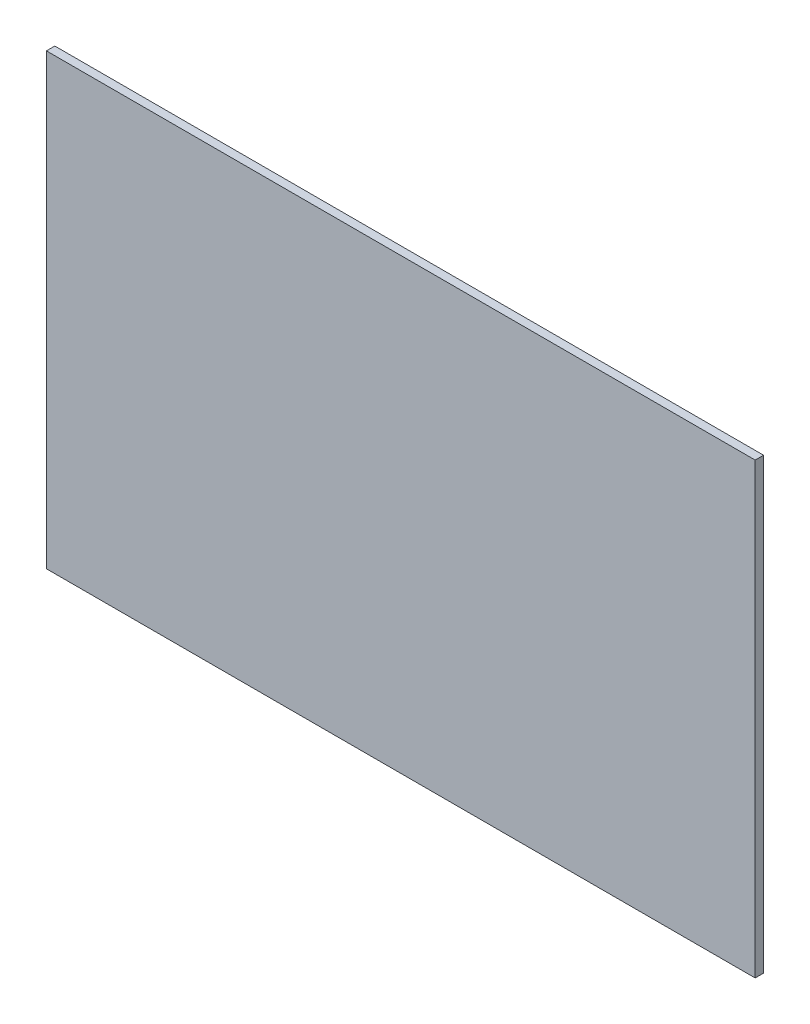
ISO-10303-21;
HEADER;
FILE_DESCRIPTION(('STEP AP214'),'2;1');
FILE_NAME('part.step','',(''),(''),'','','');
FILE_SCHEMA(('AUTOMOTIVE_DESIGN { 1 0 10303 214 1 1 1 1 }'));
ENDSEC;
DATA;
#1=APPLICATION_CONTEXT('core data for automotive mechanical design processes');
#2=APPLICATION_PROTOCOL_DEFINITION('international standard','automotive_design',2000,#1);
#3=PRODUCT_CONTEXT('',#1,'mechanical');
#4=PRODUCT('Part','Part','',(#3));
#5=PRODUCT_RELATED_PRODUCT_CATEGORY('part','',(#4));
#6=PRODUCT_DEFINITION_FORMATION('','',#4);
#7=PRODUCT_DEFINITION_CONTEXT('part definition',#1,'design');
#8=PRODUCT_DEFINITION('design','',#6,#7);
#9=PRODUCT_DEFINITION_SHAPE('','',#8);
#10=(LENGTH_UNIT() NAMED_UNIT(*) SI_UNIT(.MILLI.,.METRE.));
#11=(NAMED_UNIT(*) PLANE_ANGLE_UNIT() SI_UNIT($,.RADIAN.));
#12=(NAMED_UNIT(*) SI_UNIT($,.STERADIAN.) SOLID_ANGLE_UNIT());
#13=UNCERTAINTY_MEASURE_WITH_UNIT(LENGTH_MEASURE(1.E-05),#10,'distance_accuracy_value','');
#14=(GEOMETRIC_REPRESENTATION_CONTEXT(3) GLOBAL_UNCERTAINTY_ASSIGNED_CONTEXT((#13)) GLOBAL_UNIT_ASSIGNED_CONTEXT((#10,
#11,#12)) REPRESENTATION_CONTEXT('',''));
#15=CARTESIAN_POINT('',(0.,0.,0.));
#16=DIRECTION('',(0.,0.,1.));
#17=DIRECTION('',(1.,0.,0.));
#18=AXIS2_PLACEMENT_3D('',#15,#16,#17);
#19=CARTESIAN_POINT('',(69.3458246813066,-134.785011591823,3.));
#20=DIRECTION('',(-1.,0.,0.));
#21=DIRECTION('',(0.,0.,1.));
#22=AXIS2_PLACEMENT_3D('',#19,#20,#21);
#23=PLANE('',#22);
#24=DIRECTION('',(0.,1.,0.));
#25=VECTOR('',#24,1.);
#26=CARTESIAN_POINT('',(69.3458246813066,-134.785011591823,0.));
#27=LINE('',#26,#25);
#28=CARTESIAN_POINT('',(69.3458246813066,-134.785011591823,0.));
#29=VERTEX_POINT('',#28);
#30=CARTESIAN_POINT('',(69.3458246813066,25.4642533985034,0.));
#31=VERTEX_POINT('',#30);
#32=EDGE_CURVE('E95',#29,#31,#27,.T.);
#33=ORIENTED_EDGE('',*,*,#32,.T.);
#34=DIRECTION('',(0.,0.,-1.));
#35=VECTOR('',#34,1.);
#36=CARTESIAN_POINT('',(69.3458246813066,25.4642533985034,3.));
#37=LINE('',#36,#35);
#38=CARTESIAN_POINT('',(69.3458246813066,25.4642533985034,3.));
#39=VERTEX_POINT('',#38);
#40=EDGE_CURVE('E11',#39,#31,#37,.T.);
#41=ORIENTED_EDGE('',*,*,#40,.F.);
#42=DIRECTION('',(0.,1.,0.));
#43=VECTOR('',#42,1.);
#44=CARTESIAN_POINT('',(69.3458246813066,-134.785011591823,3.));
#45=LINE('',#44,#43);
#46=CARTESIAN_POINT('',(69.3458246813066,-134.785011591823,3.));
#47=VERTEX_POINT('',#46);
#48=EDGE_CURVE('E83',#47,#39,#45,.T.);
#49=ORIENTED_EDGE('',*,*,#48,.F.);
#50=DIRECTION('',(0.,0.,-1.));
#51=VECTOR('',#50,1.);
#52=CARTESIAN_POINT('',(69.3458246813066,-134.785011591823,3.));
#53=LINE('',#52,#51);
#54=EDGE_CURVE('E91',#47,#29,#53,.T.);
#55=ORIENTED_EDGE('',*,*,#54,.T.);
#56=EDGE_LOOP('',(#33,#41,#49,#55));
#57=FACE_BOUND('',#56,.T.);
#58=ADVANCED_FACE('F32',(#57),#23,.F.);
#59=CARTESIAN_POINT('',(-183.877122613808,25.4642533985034,3.));
#60=DIRECTION('',(0.,-1.,0.));
#61=DIRECTION('',(0.,0.,-1.));
#62=AXIS2_PLACEMENT_3D('',#59,#60,#61);
#63=PLANE('',#62);
#64=DIRECTION('',(-1.,0.,0.));
#65=VECTOR('',#64,1.);
#66=CARTESIAN_POINT('',(-183.877122613808,25.4642533985034,0.));
#67=LINE('',#66,#65);
#68=CARTESIAN_POINT('',(-183.877122613808,25.4642533985034,0.));
#69=VERTEX_POINT('',#68);
#70=EDGE_CURVE('E87',#31,#69,#67,.T.);
#71=ORIENTED_EDGE('',*,*,#70,.T.);
#72=DIRECTION('',(0.,0.,-1.));
#73=VECTOR('',#72,1.);
#74=CARTESIAN_POINT('',(-183.877122613808,25.4642533985034,3.));
#75=LINE('',#74,#73);
#76=CARTESIAN_POINT('',(-183.877122613808,25.4642533985034,3.));
#77=VERTEX_POINT('',#76);
#78=EDGE_CURVE('E40',#77,#69,#75,.T.);
#79=ORIENTED_EDGE('',*,*,#78,.F.);
#80=DIRECTION('',(-1.,0.,0.));
#81=VECTOR('',#80,1.);
#82=CARTESIAN_POINT('',(-183.877122613808,25.4642533985034,3.));
#83=LINE('',#82,#81);
#84=EDGE_CURVE('E78',#39,#77,#83,.T.);
#85=ORIENTED_EDGE('',*,*,#84,.F.);
#86=ORIENTED_EDGE('',*,*,#40,.T.);
#87=EDGE_LOOP('',(#71,#79,#85,#86));
#88=FACE_BOUND('',#87,.T.);
#89=ADVANCED_FACE('F86',(#88),#63,.F.);
#90=CARTESIAN_POINT('',(-183.877122613808,-134.785011591823,3.));
#91=DIRECTION('',(1.,0.,0.));
#92=DIRECTION('',(0.,0.,-1.));
#93=AXIS2_PLACEMENT_3D('',#90,#91,#92);
#94=PLANE('',#93);
#95=DIRECTION('',(0.,-1.,0.));
#96=VECTOR('',#95,1.);
#97=CARTESIAN_POINT('',(-183.877122613808,-134.785011591823,0.));
#98=LINE('',#97,#96);
#99=CARTESIAN_POINT('',(-183.877122613808,-134.785011591823,0.));
#100=VERTEX_POINT('',#99);
#101=EDGE_CURVE('E65',#69,#100,#98,.T.);
#102=ORIENTED_EDGE('',*,*,#101,.T.);
#103=DIRECTION('',(0.,0.,-1.));
#104=VECTOR('',#103,1.);
#105=CARTESIAN_POINT('',(-183.877122613808,-134.785011591823,3.));
#106=LINE('',#105,#104);
#107=CARTESIAN_POINT('',(-183.877122613808,-134.785011591823,3.));
#108=VERTEX_POINT('',#107);
#109=EDGE_CURVE('E88',#108,#100,#106,.T.);
#110=ORIENTED_EDGE('',*,*,#109,.F.);
#111=DIRECTION('',(0.,-1.,0.));
#112=VECTOR('',#111,1.);
#113=CARTESIAN_POINT('',(-183.877122613808,-134.785011591823,3.));
#114=LINE('',#113,#112);
#115=EDGE_CURVE('E81',#77,#108,#114,.T.);
#116=ORIENTED_EDGE('',*,*,#115,.F.);
#117=ORIENTED_EDGE('',*,*,#78,.T.);
#118=EDGE_LOOP('',(#102,#110,#116,#117));
#119=FACE_BOUND('',#118,.T.);
#120=ADVANCED_FACE('F89',(#119),#94,.F.);
#121=CARTESIAN_POINT('',(-183.877122613808,-134.785011591823,3.));
#122=DIRECTION('',(0.,1.,0.));
#123=DIRECTION('',(0.,0.,1.));
#124=AXIS2_PLACEMENT_3D('',#121,#122,#123);
#125=PLANE('',#124);
#126=DIRECTION('',(1.,0.,0.));
#127=VECTOR('',#126,1.);
#128=CARTESIAN_POINT('',(-183.877122613808,-134.785011591823,0.));
#129=LINE('',#128,#127);
#130=EDGE_CURVE('E71',#100,#29,#129,.T.);
#131=ORIENTED_EDGE('',*,*,#130,.T.);
#132=ORIENTED_EDGE('',*,*,#54,.F.);
#133=DIRECTION('',(1.,0.,0.));
#134=VECTOR('',#133,1.);
#135=CARTESIAN_POINT('',(-183.877122613808,-134.785011591823,3.));
#136=LINE('',#135,#134);
#137=EDGE_CURVE('E48',#108,#47,#136,.T.);
#138=ORIENTED_EDGE('',*,*,#137,.F.);
#139=ORIENTED_EDGE('',*,*,#109,.T.);
#140=EDGE_LOOP('',(#131,#132,#138,#139));
#141=FACE_BOUND('',#140,.T.);
#142=ADVANCED_FACE('F102',(#141),#125,.F.);
#143=CARTESIAN_POINT('',(0.,0.,3.));
#144=DIRECTION('',(0.,0.,-1.));
#145=DIRECTION('',(-1.,0.,0.));
#146=AXIS2_PLACEMENT_3D('',#143,#144,#145);
#147=PLANE('',#146);
#148=ORIENTED_EDGE('',*,*,#48,.T.);
#149=ORIENTED_EDGE('',*,*,#84,.T.);
#150=ORIENTED_EDGE('',*,*,#115,.T.);
#151=ORIENTED_EDGE('',*,*,#137,.T.);
#152=EDGE_LOOP('',(#148,#149,#150,#151));
#153=FACE_BOUND('',#152,.T.);
#154=ADVANCED_FACE('F79',(#153),#147,.F.);
#155=CARTESIAN_POINT('',(0.,0.,0.));
#156=DIRECTION('',(0.,0.,-1.));
#157=DIRECTION('',(-1.,0.,0.));
#158=AXIS2_PLACEMENT_3D('',#155,#156,#157);
#159=PLANE('',#158);
#160=ORIENTED_EDGE('',*,*,#32,.F.);
#161=ORIENTED_EDGE('',*,*,#130,.F.);
#162=ORIENTED_EDGE('',*,*,#101,.F.);
#163=ORIENTED_EDGE('',*,*,#70,.F.);
#164=EDGE_LOOP('',(#160,#161,#162,#163));
#165=FACE_BOUND('',#164,.T.);
#166=ADVANCED_FACE('F105',(#165),#159,.T.);
#167=CLOSED_SHELL('',(#58,#89,#120,#142,#154,#166));
#168=MANIFOLD_SOLID_BREP('B2',#167);
#169=ADVANCED_BREP_SHAPE_REPRESENTATION('',(#18,#168),#14);
#170=SHAPE_DEFINITION_REPRESENTATION(#9,#169);
ENDSEC;
END-ISO-10303-21;
